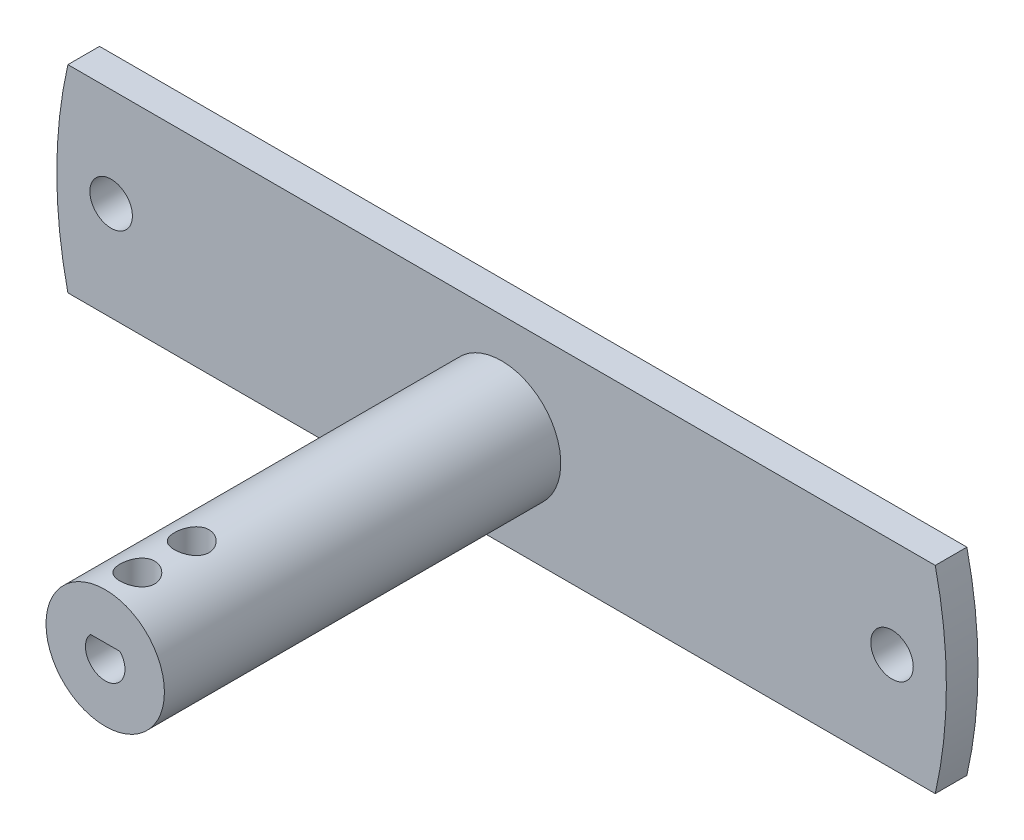
ISO-10303-21;
HEADER;
FILE_DESCRIPTION(('STEP AP214'),'2;1');
FILE_NAME('part.step','',(''),(''),'','','');
FILE_SCHEMA(('AUTOMOTIVE_DESIGN { 1 0 10303 214 1 1 1 1 }'));
ENDSEC;
DATA;
#1=APPLICATION_CONTEXT('core data for automotive mechanical design processes');
#2=APPLICATION_PROTOCOL_DEFINITION('international standard','automotive_design',2000,#1);
#3=PRODUCT_CONTEXT('',#1,'mechanical');
#4=PRODUCT('Part','Part','',(#3));
#5=PRODUCT_RELATED_PRODUCT_CATEGORY('part','',(#4));
#6=PRODUCT_DEFINITION_FORMATION('','',#4);
#7=PRODUCT_DEFINITION_CONTEXT('part definition',#1,'design');
#8=PRODUCT_DEFINITION('design','',#6,#7);
#9=PRODUCT_DEFINITION_SHAPE('','',#8);
#10=(LENGTH_UNIT() NAMED_UNIT(*) SI_UNIT(.MILLI.,.METRE.));
#11=(NAMED_UNIT(*) PLANE_ANGLE_UNIT() SI_UNIT($,.RADIAN.));
#12=(NAMED_UNIT(*) SI_UNIT($,.STERADIAN.) SOLID_ANGLE_UNIT());
#13=UNCERTAINTY_MEASURE_WITH_UNIT(LENGTH_MEASURE(1.E-05),#10,'distance_accuracy_value','');
#14=(GEOMETRIC_REPRESENTATION_CONTEXT(3) GLOBAL_UNCERTAINTY_ASSIGNED_CONTEXT((#13)) GLOBAL_UNIT_ASSIGNED_CONTEXT((#10,
#11,#12)) REPRESENTATION_CONTEXT('',''));
#15=CARTESIAN_POINT('',(0.,0.,0.));
#16=DIRECTION('',(0.,0.,1.));
#17=DIRECTION('',(1.,0.,0.));
#18=AXIS2_PLACEMENT_3D('',#15,#16,#17);
#19=CARTESIAN_POINT('',(0.,0.,3.2));
#20=DIRECTION('',(0.,0.,-1.));
#21=DIRECTION('',(-1.,0.,0.));
#22=AXIS2_PLACEMENT_3D('',#19,#20,#21);
#23=CYLINDRICAL_SURFACE('',#22,45.);
#24=CARTESIAN_POINT('',(0.,0.,0.));
#25=DIRECTION('',(0.,0.,-1.));
#26=DIRECTION('',(-1.,0.,0.));
#27=AXIS2_PLACEMENT_3D('',#24,#25,#26);
#28=CIRCLE('',#27,45.);
#29=CARTESIAN_POINT('',(-43.8748219369606,-10.,0.));
#30=VERTEX_POINT('',#29);
#31=CARTESIAN_POINT('',(-43.8748219369606,10.,0.));
#32=VERTEX_POINT('',#31);
#33=EDGE_CURVE('E127',#30,#32,#28,.T.);
#34=ORIENTED_EDGE('',*,*,#33,.F.);
#35=DIRECTION('',(0.,0.,-1.));
#36=VECTOR('',#35,1.);
#37=CARTESIAN_POINT('',(-43.8748219369606,-9.99999999999999,3.2));
#38=LINE('',#37,#36);
#39=CARTESIAN_POINT('',(-43.8748219369606,-9.99999999999999,3.2));
#40=VERTEX_POINT('',#39);
#41=EDGE_CURVE('E56',#30,#40,#38,.F.);
#42=ORIENTED_EDGE('',*,*,#41,.T.);
#43=CARTESIAN_POINT('',(0.,0.,3.2));
#44=DIRECTION('',(0.,0.,-1.));
#45=DIRECTION('',(-1.,0.,0.));
#46=AXIS2_PLACEMENT_3D('',#43,#44,#45);
#47=CIRCLE('',#46,45.);
#48=CARTESIAN_POINT('',(-43.8748219369606,10.,3.2));
#49=VERTEX_POINT('',#48);
#50=EDGE_CURVE('E129',#40,#49,#47,.T.);
#51=ORIENTED_EDGE('',*,*,#50,.T.);
#52=DIRECTION('',(0.,0.,-1.));
#53=VECTOR('',#52,1.);
#54=CARTESIAN_POINT('',(-43.8748219369606,10.,3.2));
#55=LINE('',#54,#53);
#56=EDGE_CURVE('E117',#49,#32,#55,.T.);
#57=ORIENTED_EDGE('',*,*,#56,.T.);
#58=EDGE_LOOP('',(#34,#42,#51,#57));
#59=FACE_BOUND('',#58,.T.);
#60=ADVANCED_FACE('F41',(#59),#23,.T.);
#61=CARTESIAN_POINT('',(43.8748219369606,9.99999999999999,3.2));
#62=VERTEX_POINT('',#61);
#63=CARTESIAN_POINT('',(43.8748219369606,-10.,3.2));
#64=VERTEX_POINT('',#63);
#65=EDGE_CURVE('E144',#62,#64,#47,.T.);
#66=ORIENTED_EDGE('',*,*,#65,.T.);
#67=DIRECTION('',(0.,0.,-1.));
#68=VECTOR('',#67,1.);
#69=CARTESIAN_POINT('',(43.8748219369606,-10.,3.2));
#70=LINE('',#69,#68);
#71=CARTESIAN_POINT('',(43.8748219369606,-10.,0.));
#72=VERTEX_POINT('',#71);
#73=EDGE_CURVE('E284',#64,#72,#70,.T.);
#74=ORIENTED_EDGE('',*,*,#73,.T.);
#75=CARTESIAN_POINT('',(43.8748219369606,9.99999999999999,0.));
#76=VERTEX_POINT('',#75);
#77=EDGE_CURVE('E134',#76,#72,#28,.T.);
#78=ORIENTED_EDGE('',*,*,#77,.F.);
#79=DIRECTION('',(0.,0.,-1.));
#80=VECTOR('',#79,1.);
#81=CARTESIAN_POINT('',(43.8748219369606,9.99999999999999,3.2));
#82=LINE('',#81,#80);
#83=EDGE_CURVE('E64',#76,#62,#82,.F.);
#84=ORIENTED_EDGE('',*,*,#83,.T.);
#85=EDGE_LOOP('',(#66,#74,#78,#84));
#86=FACE_BOUND('',#85,.T.);
#87=ADVANCED_FACE('F211',(#86),#23,.T.);
#88=CARTESIAN_POINT('',(0.,0.,43.3));
#89=DIRECTION('',(0.,0.,-1.));
#90=DIRECTION('',(-1.,0.,0.));
#91=AXIS2_PLACEMENT_3D('',#88,#89,#90);
#92=CYLINDRICAL_SURFACE('',#91,5.99);
#93=CARTESIAN_POINT('',(1.75,5.7286647658944,40.05));
#94=CARTESIAN_POINT('',(1.74999849954952,5.72866596481282,39.9539805321344));
#95=CARTESIAN_POINT('',(1.74207047356023,5.73110528707994,39.85794608299));
#96=CARTESIAN_POINT('',(1.71064415620623,5.74056249399311,39.6686764755281));
#97=CARTESIAN_POINT('',(1.68714003978642,5.74758209152857,39.5754423781105));
#98=CARTESIAN_POINT('',(1.62542100652919,5.76533844778758,39.3945402185607));
#99=CARTESIAN_POINT('',(1.58722961705406,5.77606925880968,39.3068635144236));
#100=CARTESIAN_POINT('',(1.49729665997941,5.8000310191613,39.1391420335143));
#101=CARTESIAN_POINT('',(1.4455532943731,5.81326230017547,39.0590982713654));
#102=CARTESIAN_POINT('',(1.32832299163368,5.84117944836808,38.9065125973945));
#103=CARTESIAN_POINT('',(1.26250079313255,5.85589507229449,38.8342336496732));
#104=CARTESIAN_POINT('',(1.11970038655035,5.8848680007928,38.7015671498216));
#105=CARTESIAN_POINT('',(1.04272081831543,5.89912524922655,38.6411810496248));
#106=CARTESIAN_POINT('',(0.877931723837882,5.9259115785428,38.5328836632923));
#107=CARTESIAN_POINT('',(0.789940146567155,5.93840149846275,38.4852388599751));
#108=CARTESIAN_POINT('',(0.606767477607407,5.95990123010377,38.4055232531116));
#109=CARTESIAN_POINT('',(0.511587857129823,5.96891175167452,38.373449272539));
#110=CARTESIAN_POINT('',(0.319490545526541,5.98222693375266,38.3266512973666));
#111=CARTESIAN_POINT('',(0.222690680117781,5.98665300808308,38.3114788138637));
#112=CARTESIAN_POINT('',(0.0278249484295567,5.99072742016157,38.2974981381615));
#113=CARTESIAN_POINT('',(-0.070240661313214,5.99037671131974,38.2986866804248));
#114=CARTESIAN_POINT('',(-0.261713885194662,5.98502366813156,38.3170896411266));
#115=CARTESIAN_POINT('',(-0.355172705766984,5.98016222594306,38.3338186730114));
#116=CARTESIAN_POINT('',(-0.537893469754315,5.96650395369827,38.3820370028783));
#117=CARTESIAN_POINT('',(-0.627155152556426,5.95770687962245,38.4135272160983));
#118=CARTESIAN_POINT('',(-0.800122405018607,5.93696755439024,38.4907131024486));
#119=CARTESIAN_POINT('',(-0.88375409721701,5.9249910045413,38.5365647335514));
#120=CARTESIAN_POINT('',(-1.04229403937443,5.89916810217805,38.6410494983552));
#121=CARTESIAN_POINT('',(-1.11720030039287,5.88532132489732,38.6996855375172));
#122=CARTESIAN_POINT('',(-1.25906051400696,5.85664579243067,38.8306069925198));
#123=CARTESIAN_POINT('',(-1.32562259663763,5.84179964657457,38.903313759069));
#124=CARTESIAN_POINT('',(-1.44571630853588,5.81324564186245,39.0590050970819));
#125=CARTESIAN_POINT('',(-1.49924677799858,5.79953788439372,39.1419905823538));
#126=CARTESIAN_POINT('',(-1.59213847931377,5.77473261298293,39.3168702216849));
#127=CARTESIAN_POINT('',(-1.63137268583594,5.76365878934006,39.408835452263));
#128=CARTESIAN_POINT('',(-1.69368482651349,5.7456588518714,39.5984648891489));
#129=CARTESIAN_POINT('',(-1.71676771306117,5.73873146673975,39.6961273385896));
#130=CARTESIAN_POINT('',(-1.74540362111343,5.73008581448065,39.8906649323367));
#131=CARTESIAN_POINT('',(-1.75154961624492,5.72819142703796,39.987445042147));
#132=CARTESIAN_POINT('',(-1.7477878110727,5.72934048736523,40.1806546674105));
#133=CARTESIAN_POINT('',(-1.73788212087411,5.73238328610797,40.2770842272757));
#134=CARTESIAN_POINT('',(-1.70282500119265,5.74289166275147,40.4644294122805));
#135=CARTESIAN_POINT('',(-1.67804912110811,5.75024819452629,40.5554220445304));
#136=CARTESIAN_POINT('',(-1.61438710119158,5.76844373342868,40.7319547798646));
#137=CARTESIAN_POINT('',(-1.57549886075321,5.77928325896779,40.8174940689962));
#138=CARTESIAN_POINT('',(-1.48357214600722,5.8035698261713,40.9831206394351));
#139=CARTESIAN_POINT('',(-1.43019586024432,5.81707669388447,41.0630114394091));
#140=CARTESIAN_POINT('',(-1.31121360595207,5.84504464557959,41.2129191983655));
#141=CARTESIAN_POINT('',(-1.24560486345228,5.85950594551791,41.2829339113961));
#142=CARTESIAN_POINT('',(-1.10124316262991,5.88837514860607,41.4136630311518));
#143=CARTESIAN_POINT('',(-1.02210604503046,5.90276290291193,41.4739586657498));
#144=CARTESIAN_POINT('',(-0.854497914162279,5.92934416146429,41.5804207243448));
#145=CARTESIAN_POINT('',(-0.766027380162811,5.94153777829244,41.6265878733624));
#146=CARTESIAN_POINT('',(-0.582865818872134,5.96228042343668,41.7030386946594));
#147=CARTESIAN_POINT('',(-0.488228062433145,5.9708568502948,41.7334421877794));
#148=CARTESIAN_POINT('',(-0.29489281470254,5.98351982522381,41.7778217561389));
#149=CARTESIAN_POINT('',(-0.19619642709971,5.98760758565825,41.7918022672047));
#150=CARTESIAN_POINT('',(-0.00142539772059387,5.99076285353007,41.8026159418251));
#151=CARTESIAN_POINT('',(0.0946129843232875,5.99000863247469,41.8000579912211));
#152=CARTESIAN_POINT('',(0.284833672807654,5.98398068749199,41.7793126752203));
#153=CARTESIAN_POINT('',(0.379016075030701,5.97870719742121,41.7611261185496));
#154=CARTESIAN_POINT('',(0.561965369496598,5.96428047512092,41.7100094046532));
#155=CARTESIAN_POINT('',(0.650776009576452,5.95516546030711,41.6772243041354));
#156=CARTESIAN_POINT('',(0.821684008355927,5.9340002589462,41.5979704137993));
#157=CARTESIAN_POINT('',(0.903780295170839,5.92194960496826,41.5514994445849));
#158=CARTESIAN_POINT('',(1.06167239470788,5.89572368407655,41.4445330272812));
#159=CARTESIAN_POINT('',(1.1371966950768,5.88149446221585,41.383650124435));
#160=CARTESIAN_POINT('',(1.27716103306232,5.85269817156102,41.250294776774));
#161=CARTESIAN_POINT('',(1.34159794066943,5.83813100867775,41.1778190703764));
#162=CARTESIAN_POINT('',(1.45935356354642,5.80983335792135,41.0209133623131));
#163=CARTESIAN_POINT('',(1.51231300160476,5.79613743161686,40.9362068321047));
#164=CARTESIAN_POINT('',(1.60317359457678,5.77166889824128,40.7587048518444));
#165=CARTESIAN_POINT('',(1.6410826543946,5.76089475750694,40.6659136794008));
#166=CARTESIAN_POINT('',(1.69696372107224,5.74466306589438,40.4865088205315));
#167=CARTESIAN_POINT('',(1.7167996149459,5.73871830854198,40.4005161455072));
#168=CARTESIAN_POINT('',(1.74331728668969,5.73071895009005,40.226352935018));
#169=CARTESIAN_POINT('',(1.75000137799038,5.72866366482639,40.1381827853389));
#170=CARTESIAN_POINT('',(1.75,5.7286647658944,40.05));
#171=B_SPLINE_CURVE_WITH_KNOTS('',3,(#93,#94,#95,#96,#97,#98,#99,#100,#101,#102,#103,#104,#105,
#106,#107,#108,#109,#110,#111,#112,#113,#114,#115,#116,#117,#118,#119,#120,#121,#122,#123,#124,
#125,#126,#127,#128,#129,#130,#131,#132,#133,#134,#135,#136,#137,#138,#139,#140,#141,#142,#143,
#144,#145,#146,#147,#148,#149,#150,#151,#152,#153,#154,#155,#156,#157,#158,#159,#160,#161,#162,
#163,#164,#165,#166,#167,#168,#169,#170),.UNSPECIFIED.,.T.,.F.,(4,2,2,2,2,2,2,2,2,2,2,2,2,2,2,2,
2,2,2,2,2,2,2,2,2,2,2,2,2,2,2,2,2,2,2,2,2,2,4),(0.,0.287733373352495,0.575574412317035,
0.862956270058567,1.15037627548514,1.44560669040764,1.74087312610092,2.04190247598271,
2.34287037885424,2.63564618985716,2.9283635658607,3.21223503837236,3.49612411410307,
3.78320971903619,4.07036063689461,4.36803140796046,4.66572866184899,4.96600999166257,
5.26619920743259,5.55573636008259,5.84523545415765,6.12771391804421,6.41023444573867,
6.70001193207344,6.98985521173615,7.28999554717243,7.59012047795121,7.88792939605676,
8.18565785784805,8.47248907652876,8.75930545358218,9.04333339270863,9.32740658613449,
9.6202186743764,9.91311328934856,10.2141581846517,10.5150447524162,10.7793411001714,
11.0435909534691),.UNSPECIFIED.);
#172=CARTESIAN_POINT('',(1.75,5.7286647658944,40.05));
#173=VERTEX_POINT('',#172);
#174=EDGE_CURVE('E164',#173,#173,#171,.T.);
#175=ORIENTED_EDGE('',*,*,#174,.F.);
#176=EDGE_LOOP('',(#175));
#177=FACE_BOUND('',#176,.T.);
#178=CARTESIAN_POINT('',(1.75,5.7286647658944,34.55));
#179=CARTESIAN_POINT('',(1.74999849954952,5.72866596481282,34.4539805321344));
#180=CARTESIAN_POINT('',(1.74207047356023,5.73110528707994,34.35794608299));
#181=CARTESIAN_POINT('',(1.71064415620623,5.74056249399311,34.1686764755281));
#182=CARTESIAN_POINT('',(1.68714003978642,5.74758209152857,34.0754423781105));
#183=CARTESIAN_POINT('',(1.62542100652919,5.76533844778758,33.8945402185607));
#184=CARTESIAN_POINT('',(1.58722961705406,5.77606925880968,33.8068635144236));
#185=CARTESIAN_POINT('',(1.49729665997941,5.8000310191613,33.6391420335143));
#186=CARTESIAN_POINT('',(1.4455532943731,5.81326230017547,33.5590982713654));
#187=CARTESIAN_POINT('',(1.32832299163368,5.84117944836808,33.4065125973945));
#188=CARTESIAN_POINT('',(1.26250079313255,5.85589507229449,33.3342336496732));
#189=CARTESIAN_POINT('',(1.11970038655035,5.8848680007928,33.2015671498216));
#190=CARTESIAN_POINT('',(1.04272081831543,5.89912524922655,33.1411810496248));
#191=CARTESIAN_POINT('',(0.877931723837882,5.9259115785428,33.0328836632923));
#192=CARTESIAN_POINT('',(0.789940146567155,5.93840149846275,32.9852388599751));
#193=CARTESIAN_POINT('',(0.606767477607407,5.95990123010377,32.9055232531116));
#194=CARTESIAN_POINT('',(0.511587857129823,5.96891175167452,32.873449272539));
#195=CARTESIAN_POINT('',(0.319490545526541,5.98222693375266,32.8266512973665));
#196=CARTESIAN_POINT('',(0.222690680117781,5.98665300808308,32.8114788138637));
#197=CARTESIAN_POINT('',(0.0278249484295567,5.99072742016157,32.7974981381615));
#198=CARTESIAN_POINT('',(-0.0702406613132141,5.99037671131974,32.7986866804248));
#199=CARTESIAN_POINT('',(-0.261713885194662,5.98502366813156,32.8170896411266));
#200=CARTESIAN_POINT('',(-0.355172705766984,5.98016222594306,32.8338186730114));
#201=CARTESIAN_POINT('',(-0.537893469754315,5.96650395369827,32.8820370028783));
#202=CARTESIAN_POINT('',(-0.627155152556426,5.95770687962245,32.9135272160983));
#203=CARTESIAN_POINT('',(-0.800122405018607,5.93696755439024,32.9907131024486));
#204=CARTESIAN_POINT('',(-0.88375409721701,5.9249910045413,33.0365647335514));
#205=CARTESIAN_POINT('',(-1.04229403937443,5.89916810217805,33.1410494983552));
#206=CARTESIAN_POINT('',(-1.11720030039287,5.88532132489732,33.1996855375172));
#207=CARTESIAN_POINT('',(-1.25906051400696,5.85664579243067,33.3306069925198));
#208=CARTESIAN_POINT('',(-1.32562259663763,5.84179964657457,33.403313759069));
#209=CARTESIAN_POINT('',(-1.44571630853588,5.81324564186245,33.5590050970819));
#210=CARTESIAN_POINT('',(-1.49924677799858,5.79953788439372,33.6419905823538));
#211=CARTESIAN_POINT('',(-1.59213847931377,5.77473261298293,33.8168702216849));
#212=CARTESIAN_POINT('',(-1.63137268583593,5.76365878934007,33.908835452263));
#213=CARTESIAN_POINT('',(-1.69368482651349,5.7456588518714,34.0984648891489));
#214=CARTESIAN_POINT('',(-1.71676771306117,5.73873146673975,34.1961273385895));
#215=CARTESIAN_POINT('',(-1.74540362111343,5.73008581448065,34.3906649323367));
#216=CARTESIAN_POINT('',(-1.75154961624492,5.72819142703796,34.487445042147));
#217=CARTESIAN_POINT('',(-1.7477878110727,5.72934048736523,34.6806546674104));
#218=CARTESIAN_POINT('',(-1.73788212087411,5.73238328610797,34.7770842272757));
#219=CARTESIAN_POINT('',(-1.70282500119265,5.74289166275147,34.9644294122805));
#220=CARTESIAN_POINT('',(-1.67804912110811,5.75024819452629,35.0554220445304));
#221=CARTESIAN_POINT('',(-1.61438710119158,5.76844373342868,35.2319547798645));
#222=CARTESIAN_POINT('',(-1.57549886075321,5.77928325896779,35.3174940689962));
#223=CARTESIAN_POINT('',(-1.48357214600722,5.8035698261713,35.4831206394351));
#224=CARTESIAN_POINT('',(-1.43019586024432,5.81707669388447,35.5630114394091));
#225=CARTESIAN_POINT('',(-1.31121360595207,5.84504464557959,35.7129191983655));
#226=CARTESIAN_POINT('',(-1.24560486345228,5.85950594551791,35.7829339113961));
#227=CARTESIAN_POINT('',(-1.10124316262991,5.88837514860607,35.9136630311518));
#228=CARTESIAN_POINT('',(-1.02210604503046,5.90276290291193,35.9739586657498));
#229=CARTESIAN_POINT('',(-0.854497914162279,5.92934416146429,36.0804207243448));
#230=CARTESIAN_POINT('',(-0.766027380162811,5.94153777829244,36.1265878733624));
#231=CARTESIAN_POINT('',(-0.582865818872134,5.96228042343668,36.2030386946594));
#232=CARTESIAN_POINT('',(-0.488228062433145,5.9708568502948,36.2334421877794));
#233=CARTESIAN_POINT('',(-0.29489281470254,5.98351982522381,36.2778217561389));
#234=CARTESIAN_POINT('',(-0.19619642709971,5.98760758565825,36.2918022672047));
#235=CARTESIAN_POINT('',(-0.00142539772059391,5.99076285353007,36.3026159418251));
#236=CARTESIAN_POINT('',(0.0946129843232874,5.99000863247469,36.3000579912211));
#237=CARTESIAN_POINT('',(0.284833672807654,5.98398068749199,36.2793126752202));
#238=CARTESIAN_POINT('',(0.379016075030701,5.97870719742121,36.2611261185496));
#239=CARTESIAN_POINT('',(0.561965369496599,5.96428047512092,36.2100094046532));
#240=CARTESIAN_POINT('',(0.650776009576454,5.95516546030711,36.1772243041354));
#241=CARTESIAN_POINT('',(0.821684008355929,5.9340002589462,36.0979704137993));
#242=CARTESIAN_POINT('',(0.90378029517084,5.92194960496826,36.0514994445849));
#243=CARTESIAN_POINT('',(1.06167239470788,5.89572368407655,35.9445330272812));
#244=CARTESIAN_POINT('',(1.1371966950768,5.88149446221585,35.883650124435));
#245=CARTESIAN_POINT('',(1.27716103306232,5.85269817156102,35.750294776774));
#246=CARTESIAN_POINT('',(1.34159794066943,5.83813100867775,35.6778190703764));
#247=CARTESIAN_POINT('',(1.45935356354642,5.80983335792135,35.5209133623131));
#248=CARTESIAN_POINT('',(1.51231300160476,5.79613743161685,35.4362068321047));
#249=CARTESIAN_POINT('',(1.60317359457678,5.77166889824128,35.2587048518444));
#250=CARTESIAN_POINT('',(1.6410826543946,5.76089475750694,35.1659136794008));
#251=CARTESIAN_POINT('',(1.69696372107224,5.74466306589438,34.9865088205315));
#252=CARTESIAN_POINT('',(1.7167996149459,5.73871830854198,34.9005161455072));
#253=CARTESIAN_POINT('',(1.74331728668969,5.73071895009005,34.726352935018));
#254=CARTESIAN_POINT('',(1.75000137799038,5.72866366482639,34.6381827853389));
#255=CARTESIAN_POINT('',(1.75,5.7286647658944,34.55));
#256=B_SPLINE_CURVE_WITH_KNOTS('',3,(#178,#179,#180,#181,#182,#183,#184,#185,#186,#187,#188,
#189,#190,#191,#192,#193,#194,#195,#196,#197,#198,#199,#200,#201,#202,#203,#204,#205,#206,#207,
#208,#209,#210,#211,#212,#213,#214,#215,#216,#217,#218,#219,#220,#221,#222,#223,#224,#225,#226,
#227,#228,#229,#230,#231,#232,#233,#234,#235,#236,#237,#238,#239,#240,#241,#242,#243,#244,#245,
#246,#247,#248,#249,#250,#251,#252,#253,#254,#255),.UNSPECIFIED.,.T.,.F.,(4,2,2,2,2,2,2,2,2,2,2,
2,2,2,2,2,2,2,2,2,2,2,2,2,2,2,2,2,2,2,2,2,2,2,2,2,2,2,4),(0.,0.287733373352495,
0.575574412317035,0.862956270058567,1.15037627548514,1.44560669040764,1.74087312610092,
2.04190247598271,2.34287037885424,2.63564618985716,2.9283635658607,3.21223503837236,
3.49612411410307,3.78320971903619,4.07036063689461,4.36803140796046,4.66572866184899,
4.96600999166256,5.26619920743259,5.55573636008259,5.84523545415765,6.12771391804421,
6.41023444573867,6.70001193207344,6.98985521173615,7.28999554717243,7.59012047795121,
7.88792939605676,8.18565785784805,8.47248907652876,8.75930545358218,9.04333339270863,
9.32740658613449,9.6202186743764,9.91311328934856,10.2141581846517,10.5150447524162,
10.7793411001714,11.0435909534691),.UNSPECIFIED.);
#257=CARTESIAN_POINT('',(1.75,5.7286647658944,34.55));
#258=VERTEX_POINT('',#257);
#259=EDGE_CURVE('E151',#258,#258,#256,.T.);
#260=ORIENTED_EDGE('',*,*,#259,.F.);
#261=EDGE_LOOP('',(#260));
#262=FACE_BOUND('',#261,.T.);
#263=CARTESIAN_POINT('',(0.,0.,43.3));
#264=DIRECTION('',(0.,0.,1.));
#265=DIRECTION('',(1.,0.,0.));
#266=AXIS2_PLACEMENT_3D('',#263,#264,#265);
#267=CIRCLE('',#266,5.99);
#268=CARTESIAN_POINT('',(5.99,0.,43.3));
#269=VERTEX_POINT('',#268);
#270=EDGE_CURVE('E252',#269,#269,#267,.T.);
#271=ORIENTED_EDGE('',*,*,#270,.F.);
#272=EDGE_LOOP('',(#271));
#273=FACE_BOUND('',#272,.T.);
#274=CARTESIAN_POINT('',(0.,0.,3.2));
#275=DIRECTION('',(0.,0.,-1.));
#276=DIRECTION('',(-1.,0.,0.));
#277=AXIS2_PLACEMENT_3D('',#274,#275,#276);
#278=CIRCLE('',#277,5.99);
#279=CARTESIAN_POINT('',(-5.99,0.,3.2));
#280=VERTEX_POINT('',#279);
#281=EDGE_CURVE('E123',#280,#280,#278,.T.);
#282=ORIENTED_EDGE('',*,*,#281,.F.);
#283=EDGE_LOOP('',(#282));
#284=FACE_BOUND('',#283,.T.);
#285=ADVANCED_FACE('F43',(#177,#262,#273,#284),#92,.T.);
#286=CARTESIAN_POINT('',(0.,0.,43.3));
#287=DIRECTION('',(0.,0.,-1.));
#288=DIRECTION('',(-1.,0.,0.));
#289=AXIS2_PLACEMENT_3D('',#286,#287,#288);
#290=CYLINDRICAL_SURFACE('',#289,2.);
#291=DIRECTION('',(0.,0.,-1.));
#292=VECTOR('',#291,1.);
#293=CARTESIAN_POINT('',(1.5,1.3228756555323,43.3));
#294=LINE('',#293,#292);
#295=CARTESIAN_POINT('',(1.5,1.3228756555323,33.648612181134));
#296=VERTEX_POINT('',#295);
#297=CARTESIAN_POINT('',(1.5,1.3228756555323,3.20000000000002));
#298=VERTEX_POINT('',#297);
#299=EDGE_CURVE('E253',#296,#298,#294,.T.);
#300=ORIENTED_EDGE('',*,*,#299,.T.);
#301=CARTESIAN_POINT('',(0.,0.,3.2));
#302=DIRECTION('',(0.,0.,-1.));
#303=DIRECTION('',(-1.,0.,0.));
#304=AXIS2_PLACEMENT_3D('',#301,#302,#303);
#305=CIRCLE('',#304,2.);
#306=CARTESIAN_POINT('',(-1.5,1.3228756555323,3.2));
#307=VERTEX_POINT('',#306);
#308=EDGE_CURVE('E140',#298,#307,#305,.T.);
#309=ORIENTED_EDGE('',*,*,#308,.T.);
#310=DIRECTION('',(0.,0.,-1.));
#311=VECTOR('',#310,1.);
#312=CARTESIAN_POINT('',(-1.5,1.3228756555323,43.3));
#313=LINE('',#312,#311);
#314=CARTESIAN_POINT('',(-1.5,1.3228756555323,33.648612181134));
#315=VERTEX_POINT('',#314);
#316=EDGE_CURVE('E325',#315,#307,#313,.T.);
#317=ORIENTED_EDGE('',*,*,#316,.F.);
#318=CARTESIAN_POINT('',(-1.5,1.32287565553229,35.451387818866));
#319=VERTEX_POINT('',#318);
#320=EDGE_CURVE('E327',#319,#315,#313,.T.);
#321=ORIENTED_EDGE('',*,*,#320,.F.);
#322=CARTESIAN_POINT('',(-1.5,1.3228756555323,39.148612181134));
#323=VERTEX_POINT('',#322);
#324=EDGE_CURVE('E332',#323,#319,#313,.T.);
#325=ORIENTED_EDGE('',*,*,#324,.F.);
#326=CARTESIAN_POINT('',(-1.5,1.32287565553229,40.951387818866));
#327=VERTEX_POINT('',#326);
#328=EDGE_CURVE('E331',#327,#323,#313,.T.);
#329=ORIENTED_EDGE('',*,*,#328,.F.);
#330=CARTESIAN_POINT('',(-1.5,1.3228756555323,43.3));
#331=VERTEX_POINT('',#330);
#332=EDGE_CURVE('E256',#331,#327,#313,.T.);
#333=ORIENTED_EDGE('',*,*,#332,.F.);
#334=CARTESIAN_POINT('',(0.,0.,43.3));
#335=DIRECTION('',(0.,0.,1.));
#336=DIRECTION('',(1.,0.,0.));
#337=AXIS2_PLACEMENT_3D('',#334,#335,#336);
#338=CIRCLE('',#337,2.);
#339=CARTESIAN_POINT('',(1.5,1.3228756555323,43.3));
#340=VERTEX_POINT('',#339);
#341=EDGE_CURVE('E321',#331,#340,#338,.T.);
#342=ORIENTED_EDGE('',*,*,#341,.T.);
#343=CARTESIAN_POINT('',(1.5,1.3228756555323,40.951387818866));
#344=VERTEX_POINT('',#343);
#345=EDGE_CURVE('E251',#340,#344,#294,.T.);
#346=ORIENTED_EDGE('',*,*,#345,.T.);
#347=CARTESIAN_POINT('',(1.5,1.3228756555323,39.148612181134));
#348=VERTEX_POINT('',#347);
#349=EDGE_CURVE('E235',#344,#348,#294,.T.);
#350=ORIENTED_EDGE('',*,*,#349,.T.);
#351=CARTESIAN_POINT('',(1.5,1.3228756555323,35.451387818866));
#352=VERTEX_POINT('',#351);
#353=EDGE_CURVE('E240',#348,#352,#294,.T.);
#354=ORIENTED_EDGE('',*,*,#353,.T.);
#355=EDGE_CURVE('E246',#352,#296,#294,.T.);
#356=ORIENTED_EDGE('',*,*,#355,.T.);
#357=EDGE_LOOP('',(#300,#309,#317,#321,#325,#329,#333,#342,#346,#350,#354,#356));
#358=FACE_BOUND('',#357,.T.);
#359=ADVANCED_FACE('F188',(#358),#290,.F.);
#360=CARTESIAN_POINT('',(-1.5,1.3228756555323,43.3));
#361=DIRECTION('',(0.,-1.,0.));
#362=DIRECTION('',(0.,0.,-1.));
#363=AXIS2_PLACEMENT_3D('',#360,#361,#362);
#364=PLANE('',#363);
#365=ORIENTED_EDGE('',*,*,#316,.T.);
#366=DIRECTION('',(1.,0.,0.));
#367=VECTOR('',#366,1.);
#368=CARTESIAN_POINT('',(-1.5,1.3228756555323,3.2));
#369=LINE('',#368,#367);
#370=EDGE_CURVE('E147',#307,#298,#369,.T.);
#371=ORIENTED_EDGE('',*,*,#370,.T.);
#372=ORIENTED_EDGE('',*,*,#299,.F.);
#373=CARTESIAN_POINT('',(0.,1.3228756555323,34.55));
#374=DIRECTION('',(0.,-1.,0.));
#375=DIRECTION('',(0.,0.,-1.));
#376=AXIS2_PLACEMENT_3D('',#373,#374,#375);
#377=CIRCLE('',#376,1.75);
#378=EDGE_CURVE('E260',#296,#315,#377,.F.);
#379=ORIENTED_EDGE('',*,*,#378,.T.);
#380=EDGE_LOOP('',(#365,#371,#372,#379));
#381=FACE_BOUND('',#380,.T.);
#382=ADVANCED_FACE('F184',(#381),#364,.T.);
#383=ORIENTED_EDGE('',*,*,#332,.T.);
#384=CARTESIAN_POINT('',(0.,1.3228756555323,40.05));
#385=DIRECTION('',(0.,1.,0.));
#386=DIRECTION('',(-1.,0.,0.));
#387=AXIS2_PLACEMENT_3D('',#384,#385,#386);
#388=CIRCLE('',#387,1.75);
#389=EDGE_CURVE('E148',#327,#344,#388,.T.);
#390=ORIENTED_EDGE('',*,*,#389,.T.);
#391=ORIENTED_EDGE('',*,*,#345,.F.);
#392=DIRECTION('',(-1.,0.,0.));
#393=VECTOR('',#392,1.);
#394=CARTESIAN_POINT('',(-1.5,1.3228756555323,43.3));
#395=LINE('',#394,#393);
#396=EDGE_CURVE('E320',#340,#331,#395,.T.);
#397=ORIENTED_EDGE('',*,*,#396,.T.);
#398=EDGE_LOOP('',(#383,#390,#391,#397));
#399=FACE_BOUND('',#398,.T.);
#400=ADVANCED_FACE('F187',(#399),#364,.T.);
#401=ORIENTED_EDGE('',*,*,#353,.F.);
#402=CARTESIAN_POINT('',(0.,1.3228756555323,40.05));
#403=DIRECTION('',(0.,-1.,0.));
#404=DIRECTION('',(0.,0.,-1.));
#405=AXIS2_PLACEMENT_3D('',#402,#403,#404);
#406=CIRCLE('',#405,1.75);
#407=EDGE_CURVE('E242',#348,#323,#406,.F.);
#408=ORIENTED_EDGE('',*,*,#407,.T.);
#409=ORIENTED_EDGE('',*,*,#324,.T.);
#410=CARTESIAN_POINT('',(0.,1.3228756555323,34.55));
#411=DIRECTION('',(0.,1.,0.));
#412=DIRECTION('',(-1.,0.,0.));
#413=AXIS2_PLACEMENT_3D('',#410,#411,#412);
#414=CIRCLE('',#413,1.75);
#415=EDGE_CURVE('E154',#319,#352,#414,.T.);
#416=ORIENTED_EDGE('',*,*,#415,.T.);
#417=EDGE_LOOP('',(#401,#408,#409,#416));
#418=FACE_BOUND('',#417,.T.);
#419=ADVANCED_FACE('F190',(#418),#364,.T.);
#420=CARTESIAN_POINT('',(0.,0.,43.3));
#421=DIRECTION('',(0.,0.,1.));
#422=DIRECTION('',(1.,0.,0.));
#423=AXIS2_PLACEMENT_3D('',#420,#421,#422);
#424=PLANE('',#423);
#425=ORIENTED_EDGE('',*,*,#270,.T.);
#426=EDGE_LOOP('',(#425));
#427=FACE_BOUND('',#426,.T.);
#428=ORIENTED_EDGE('',*,*,#396,.F.);
#429=ORIENTED_EDGE('',*,*,#341,.F.);
#430=EDGE_LOOP('',(#428,#429));
#431=FACE_BOUND('',#430,.T.);
#432=ADVANCED_FACE('F194',(#427,#431),#424,.T.);
#433=CARTESIAN_POINT('',(0.,1.3228756555323,34.55));
#434=DIRECTION('',(0.,1.,0.));
#435=DIRECTION('',(-1.,0.,0.));
#436=AXIS2_PLACEMENT_3D('',#433,#434,#435);
#437=PLANE('',#436);
#438=EDGE_CURVE('E157',#352,#296,#414,.T.);
#439=ORIENTED_EDGE('',*,*,#438,.T.);
#440=ORIENTED_EDGE('',*,*,#355,.F.);
#441=EDGE_LOOP('',(#439,#440));
#442=FACE_BOUND('',#441,.T.);
#443=ADVANCED_FACE('F175',(#442),#437,.T.);
#444=CARTESIAN_POINT('',(0.,8.8228756555323,34.55));
#445=DIRECTION('',(0.,-1.,0.));
#446=DIRECTION('',(1.,0.,0.));
#447=AXIS2_PLACEMENT_3D('',#444,#445,#446);
#448=CYLINDRICAL_SURFACE('',#447,1.75);
#449=ORIENTED_EDGE('',*,*,#415,.F.);
#450=EDGE_CURVE('E143',#315,#319,#414,.T.);
#451=ORIENTED_EDGE('',*,*,#450,.F.);
#452=ORIENTED_EDGE('',*,*,#378,.F.);
#453=ORIENTED_EDGE('',*,*,#438,.F.);
#454=EDGE_LOOP('',(#449,#451,#452,#453));
#455=FACE_BOUND('',#454,.T.);
#456=ORIENTED_EDGE('',*,*,#259,.T.);
#457=EDGE_LOOP('',(#456));
#458=FACE_BOUND('',#457,.T.);
#459=ADVANCED_FACE('F170',(#455,#458),#448,.F.);
#460=ORIENTED_EDGE('',*,*,#450,.T.);
#461=ORIENTED_EDGE('',*,*,#320,.T.);
#462=EDGE_LOOP('',(#460,#461));
#463=FACE_BOUND('',#462,.T.);
#464=ADVANCED_FACE('F174',(#463),#437,.T.);
#465=CARTESIAN_POINT('',(0.,1.3228756555323,40.05));
#466=DIRECTION('',(0.,1.,0.));
#467=DIRECTION('',(-1.,0.,0.));
#468=AXIS2_PLACEMENT_3D('',#465,#466,#467);
#469=PLANE('',#468);
#470=EDGE_CURVE('E152',#344,#348,#388,.T.);
#471=ORIENTED_EDGE('',*,*,#470,.T.);
#472=ORIENTED_EDGE('',*,*,#349,.F.);
#473=EDGE_LOOP('',(#471,#472));
#474=FACE_BOUND('',#473,.T.);
#475=ADVANCED_FACE('F182',(#474),#469,.T.);
#476=CARTESIAN_POINT('',(0.,8.8228756555323,40.05));
#477=DIRECTION('',(0.,-1.,0.));
#478=DIRECTION('',(1.,0.,0.));
#479=AXIS2_PLACEMENT_3D('',#476,#477,#478);
#480=CYLINDRICAL_SURFACE('',#479,1.75);
#481=ORIENTED_EDGE('',*,*,#389,.F.);
#482=EDGE_CURVE('E153',#323,#327,#388,.T.);
#483=ORIENTED_EDGE('',*,*,#482,.F.);
#484=ORIENTED_EDGE('',*,*,#407,.F.);
#485=ORIENTED_EDGE('',*,*,#470,.F.);
#486=EDGE_LOOP('',(#481,#483,#484,#485));
#487=FACE_BOUND('',#486,.T.);
#488=ORIENTED_EDGE('',*,*,#174,.T.);
#489=EDGE_LOOP('',(#488));
#490=FACE_BOUND('',#489,.T.);
#491=ADVANCED_FACE('F177',(#487,#490),#480,.F.);
#492=ORIENTED_EDGE('',*,*,#482,.T.);
#493=ORIENTED_EDGE('',*,*,#328,.T.);
#494=EDGE_LOOP('',(#492,#493));
#495=FACE_BOUND('',#494,.T.);
#496=ADVANCED_FACE('F218',(#495),#469,.T.);
#497=CARTESIAN_POINT('',(0.,0.,3.2));
#498=DIRECTION('',(0.,0.,-1.));
#499=DIRECTION('',(-1.,0.,0.));
#500=AXIS2_PLACEMENT_3D('',#497,#498,#499);
#501=PLANE('',#500);
#502=ORIENTED_EDGE('',*,*,#308,.F.);
#503=ORIENTED_EDGE('',*,*,#370,.F.);
#504=EDGE_LOOP('',(#502,#503));
#505=FACE_BOUND('',#504,.T.);
#506=ADVANCED_FACE('F207',(#505),#501,.F.);
#507=DIRECTION('',(-1.,0.,0.));
#508=VECTOR('',#507,1.);
#509=CARTESIAN_POINT('',(0.,-10.,3.2));
#510=LINE('',#509,#508);
#511=EDGE_CURVE('E135',#64,#40,#510,.T.);
#512=ORIENTED_EDGE('',*,*,#511,.F.);
#513=ORIENTED_EDGE('',*,*,#65,.F.);
#514=DIRECTION('',(1.,0.,0.));
#515=VECTOR('',#514,1.);
#516=CARTESIAN_POINT('',(0.,10.,3.2));
#517=LINE('',#516,#515);
#518=EDGE_CURVE('E282',#49,#62,#517,.T.);
#519=ORIENTED_EDGE('',*,*,#518,.F.);
#520=ORIENTED_EDGE('',*,*,#50,.F.);
#521=EDGE_LOOP('',(#512,#513,#519,#520));
#522=FACE_BOUND('',#521,.T.);
#523=CARTESIAN_POINT('',(-39.5,0.,3.2));
#524=DIRECTION('',(0.,0.,-1.));
#525=DIRECTION('',(-1.,0.,0.));
#526=AXIS2_PLACEMENT_3D('',#523,#524,#525);
#527=CIRCLE('',#526,2.15);
#528=CARTESIAN_POINT('',(-37.35,0.,3.2));
#529=VERTEX_POINT('',#528);
#530=EDGE_CURVE('E130',#529,#529,#527,.F.);
#531=ORIENTED_EDGE('',*,*,#530,.F.);
#532=EDGE_LOOP('',(#531));
#533=FACE_BOUND('',#532,.T.);
#534=CARTESIAN_POINT('',(39.5,0.,3.2));
#535=DIRECTION('',(0.,0.,-1.));
#536=DIRECTION('',(-1.,0.,0.));
#537=AXIS2_PLACEMENT_3D('',#534,#535,#536);
#538=CIRCLE('',#537,2.15);
#539=CARTESIAN_POINT('',(41.65,0.,3.2));
#540=VERTEX_POINT('',#539);
#541=EDGE_CURVE('E269',#540,#540,#538,.F.);
#542=ORIENTED_EDGE('',*,*,#541,.F.);
#543=EDGE_LOOP('',(#542));
#544=FACE_BOUND('',#543,.T.);
#545=ORIENTED_EDGE('',*,*,#281,.T.);
#546=EDGE_LOOP('',(#545));
#547=FACE_BOUND('',#546,.T.);
#548=ADVANCED_FACE('F199',(#522,#533,#544,#547),#501,.F.);
#549=CARTESIAN_POINT('',(0.,0.,0.));
#550=DIRECTION('',(0.,0.,1.));
#551=DIRECTION('',(1.,0.,0.));
#552=AXIS2_PLACEMENT_3D('',#549,#550,#551);
#553=PLANE('',#552);
#554=DIRECTION('',(1.,0.,0.));
#555=VECTOR('',#554,1.);
#556=CARTESIAN_POINT('',(0.,-10.,0.));
#557=LINE('',#556,#555);
#558=EDGE_CURVE('E11',#30,#72,#557,.T.);
#559=ORIENTED_EDGE('',*,*,#558,.F.);
#560=ORIENTED_EDGE('',*,*,#33,.T.);
#561=DIRECTION('',(-1.,0.,0.));
#562=VECTOR('',#561,1.);
#563=CARTESIAN_POINT('',(0.,10.,0.));
#564=LINE('',#563,#562);
#565=EDGE_CURVE('E50',#76,#32,#564,.T.);
#566=ORIENTED_EDGE('',*,*,#565,.F.);
#567=ORIENTED_EDGE('',*,*,#77,.T.);
#568=EDGE_LOOP('',(#559,#560,#566,#567));
#569=FACE_BOUND('',#568,.T.);
#570=CARTESIAN_POINT('',(-39.5,0.,0.));
#571=DIRECTION('',(0.,0.,1.));
#572=DIRECTION('',(1.,0.,0.));
#573=AXIS2_PLACEMENT_3D('',#570,#571,#572);
#574=CIRCLE('',#573,2.15);
#575=CARTESIAN_POINT('',(-37.35,0.,0.));
#576=VERTEX_POINT('',#575);
#577=EDGE_CURVE('E270',#576,#576,#574,.F.);
#578=ORIENTED_EDGE('',*,*,#577,.F.);
#579=EDGE_LOOP('',(#578));
#580=FACE_BOUND('',#579,.T.);
#581=CARTESIAN_POINT('',(39.5,0.,0.));
#582=DIRECTION('',(0.,0.,1.));
#583=DIRECTION('',(1.,0.,0.));
#584=AXIS2_PLACEMENT_3D('',#581,#582,#583);
#585=CIRCLE('',#584,2.15);
#586=CARTESIAN_POINT('',(41.65,0.,0.));
#587=VERTEX_POINT('',#586);
#588=EDGE_CURVE('E266',#587,#587,#585,.F.);
#589=ORIENTED_EDGE('',*,*,#588,.F.);
#590=EDGE_LOOP('',(#589));
#591=FACE_BOUND('',#590,.T.);
#592=ADVANCED_FACE('F132',(#569,#580,#591),#553,.F.);
#593=CARTESIAN_POINT('',(39.5,0.,-1.2E-05));
#594=DIRECTION('',(0.,0.,1.));
#595=DIRECTION('',(1.,0.,0.));
#596=AXIS2_PLACEMENT_3D('',#593,#594,#595);
#597=CYLINDRICAL_SURFACE('',#596,2.15);
#598=CARTESIAN_POINT('',(41.65,0.,0.));
#599=CARTESIAN_POINT('',(41.65,0.,0.0333333333333334));
#600=CARTESIAN_POINT('',(41.65,0.,0.0666666666666667));
#601=CARTESIAN_POINT('',(41.65,0.,0.133333333333333));
#602=CARTESIAN_POINT('',(41.65,0.,0.166666666666667));
#603=CARTESIAN_POINT('',(41.65,0.,0.233333333333333));
#604=CARTESIAN_POINT('',(41.65,0.,0.266666666666667));
#605=CARTESIAN_POINT('',(41.65,0.,0.333333333333333));
#606=CARTESIAN_POINT('',(41.65,0.,0.366666666666667));
#607=CARTESIAN_POINT('',(41.65,0.,0.433333333333333));
#608=CARTESIAN_POINT('',(41.65,0.,0.466666666666667));
#609=CARTESIAN_POINT('',(41.65,0.,0.533333333333333));
#610=CARTESIAN_POINT('',(41.65,0.,0.566666666666667));
#611=CARTESIAN_POINT('',(41.65,0.,0.633333333333333));
#612=CARTESIAN_POINT('',(41.65,0.,0.666666666666667));
#613=CARTESIAN_POINT('',(41.65,0.,0.733333333333334));
#614=CARTESIAN_POINT('',(41.65,0.,0.766666666666667));
#615=CARTESIAN_POINT('',(41.65,0.,0.833333333333333));
#616=CARTESIAN_POINT('',(41.65,0.,0.866666666666667));
#617=CARTESIAN_POINT('',(41.65,0.,0.933333333333333));
#618=CARTESIAN_POINT('',(41.65,0.,0.966666666666667));
#619=CARTESIAN_POINT('',(41.65,0.,1.03333333333333));
#620=CARTESIAN_POINT('',(41.65,0.,1.06666666666667));
#621=CARTESIAN_POINT('',(41.65,0.,1.13333333333333));
#622=CARTESIAN_POINT('',(41.65,0.,1.16666666666667));
#623=CARTESIAN_POINT('',(41.65,0.,1.23333333333333));
#624=CARTESIAN_POINT('',(41.65,0.,1.26666666666667));
#625=CARTESIAN_POINT('',(41.65,0.,1.33333333333333));
#626=CARTESIAN_POINT('',(41.65,0.,1.36666666666667));
#627=CARTESIAN_POINT('',(41.65,0.,1.43333333333333));
#628=CARTESIAN_POINT('',(41.65,0.,1.46666666666667));
#629=CARTESIAN_POINT('',(41.65,0.,1.53333333333333));
#630=CARTESIAN_POINT('',(41.65,0.,1.56666666666667));
#631=CARTESIAN_POINT('',(41.65,0.,1.63333333333333));
#632=CARTESIAN_POINT('',(41.65,0.,1.66666666666667));
#633=CARTESIAN_POINT('',(41.65,0.,1.73333333333333));
#634=CARTESIAN_POINT('',(41.65,0.,1.76666666666667));
#635=CARTESIAN_POINT('',(41.65,0.,1.83333333333333));
#636=CARTESIAN_POINT('',(41.65,0.,1.86666666666667));
#637=CARTESIAN_POINT('',(41.65,0.,1.93333333333333));
#638=CARTESIAN_POINT('',(41.65,0.,1.96666666666667));
#639=CARTESIAN_POINT('',(41.65,0.,2.03333333333333));
#640=CARTESIAN_POINT('',(41.65,0.,2.06666666666667));
#641=CARTESIAN_POINT('',(41.65,0.,2.13333333333333));
#642=CARTESIAN_POINT('',(41.65,0.,2.16666666666667));
#643=CARTESIAN_POINT('',(41.65,0.,2.23333333333333));
#644=CARTESIAN_POINT('',(41.65,0.,2.26666666666667));
#645=CARTESIAN_POINT('',(41.65,0.,2.33333333333333));
#646=CARTESIAN_POINT('',(41.65,0.,2.36666666666667));
#647=CARTESIAN_POINT('',(41.65,0.,2.43333333333333));
#648=CARTESIAN_POINT('',(41.65,0.,2.46666666666667));
#649=CARTESIAN_POINT('',(41.65,0.,2.53333333333333));
#650=CARTESIAN_POINT('',(41.65,0.,2.56666666666667));
#651=CARTESIAN_POINT('',(41.65,0.,2.63333333333333));
#652=CARTESIAN_POINT('',(41.65,0.,2.66666666666667));
#653=CARTESIAN_POINT('',(41.65,0.,2.73333333333333));
#654=CARTESIAN_POINT('',(41.65,0.,2.76666666666667));
#655=CARTESIAN_POINT('',(41.65,0.,2.83333333333333));
#656=CARTESIAN_POINT('',(41.65,0.,2.86666666666667));
#657=CARTESIAN_POINT('',(41.65,0.,2.93333333333333));
#658=CARTESIAN_POINT('',(41.65,0.,2.96666666666667));
#659=CARTESIAN_POINT('',(41.65,0.,3.03333333333333));
#660=CARTESIAN_POINT('',(41.65,0.,3.06666666666667));
#661=CARTESIAN_POINT('',(41.65,0.,3.13333333333333));
#662=CARTESIAN_POINT('',(41.65,0.,3.16666666666667));
#663=CARTESIAN_POINT('',(41.65,0.,3.2));
#664=B_SPLINE_CURVE_WITH_KNOTS('',3,(#598,#599,#600,#601,#602,#603,#604,#605,#606,#607,#608,
#609,#610,#611,#612,#613,#614,#615,#616,#617,#618,#619,#620,#621,#622,#623,#624,#625,#626,#627,
#628,#629,#630,#631,#632,#633,#634,#635,#636,#637,#638,#639,#640,#641,#642,#643,#644,#645,#646,
#647,#648,#649,#650,#651,#652,#653,#654,#655,#656,#657,#658,#659,#660,#661,#662,#663),
.UNSPECIFIED.,.F.,.F.,(4,2,2,2,2,2,2,2,2,2,2,2,2,2,2,2,2,2,2,2,2,2,2,2,2,2,2,2,2,2,2,2,4),(0.,
0.1,0.2,0.3,0.4,0.5,0.6,0.7,0.8,0.9,1.,1.1,1.2,1.3,1.4,1.5,1.6,1.7,1.8,1.9,2.,2.1,2.2,2.3,2.4,
2.5,2.6,2.7,2.8,2.9,3.,3.1,3.2),.UNSPECIFIED.);
#665=EDGE_CURVE('BSEAM198',#587,#540,#664,.T.);
#666=ORIENTED_EDGE('',*,*,#588,.T.);
#667=ORIENTED_EDGE('',*,*,#541,.T.);
#668=ORIENTED_EDGE('',*,*,#665,.T.);
#669=ORIENTED_EDGE('',*,*,#665,.F.);
#670=EDGE_LOOP('',(#666,#668,#667,#669));
#671=FACE_BOUND('',#670,.T.);
#672=ADVANCED_FACE('F198',(#671),#597,.F.);
#673=CARTESIAN_POINT('',(-39.5,0.,-1.2E-05));
#674=DIRECTION('',(0.,0.,1.));
#675=DIRECTION('',(1.,0.,0.));
#676=AXIS2_PLACEMENT_3D('',#673,#674,#675);
#677=CYLINDRICAL_SURFACE('',#676,2.15);
#678=CARTESIAN_POINT('',(-37.35,0.,0.));
#679=CARTESIAN_POINT('',(-37.35,0.,0.0333333333333334));
#680=CARTESIAN_POINT('',(-37.35,0.,0.0666666666666667));
#681=CARTESIAN_POINT('',(-37.35,0.,0.133333333333333));
#682=CARTESIAN_POINT('',(-37.35,0.,0.166666666666667));
#683=CARTESIAN_POINT('',(-37.35,0.,0.233333333333333));
#684=CARTESIAN_POINT('',(-37.35,0.,0.266666666666667));
#685=CARTESIAN_POINT('',(-37.35,0.,0.333333333333333));
#686=CARTESIAN_POINT('',(-37.35,0.,0.366666666666667));
#687=CARTESIAN_POINT('',(-37.35,0.,0.433333333333333));
#688=CARTESIAN_POINT('',(-37.35,0.,0.466666666666667));
#689=CARTESIAN_POINT('',(-37.35,0.,0.533333333333333));
#690=CARTESIAN_POINT('',(-37.35,0.,0.566666666666667));
#691=CARTESIAN_POINT('',(-37.35,0.,0.633333333333333));
#692=CARTESIAN_POINT('',(-37.35,0.,0.666666666666667));
#693=CARTESIAN_POINT('',(-37.35,0.,0.733333333333334));
#694=CARTESIAN_POINT('',(-37.35,0.,0.766666666666667));
#695=CARTESIAN_POINT('',(-37.35,0.,0.833333333333333));
#696=CARTESIAN_POINT('',(-37.35,0.,0.866666666666667));
#697=CARTESIAN_POINT('',(-37.35,0.,0.933333333333333));
#698=CARTESIAN_POINT('',(-37.35,0.,0.966666666666667));
#699=CARTESIAN_POINT('',(-37.35,0.,1.03333333333333));
#700=CARTESIAN_POINT('',(-37.35,0.,1.06666666666667));
#701=CARTESIAN_POINT('',(-37.35,0.,1.13333333333333));
#702=CARTESIAN_POINT('',(-37.35,0.,1.16666666666667));
#703=CARTESIAN_POINT('',(-37.35,0.,1.23333333333333));
#704=CARTESIAN_POINT('',(-37.35,0.,1.26666666666667));
#705=CARTESIAN_POINT('',(-37.35,0.,1.33333333333333));
#706=CARTESIAN_POINT('',(-37.35,0.,1.36666666666667));
#707=CARTESIAN_POINT('',(-37.35,0.,1.43333333333333));
#708=CARTESIAN_POINT('',(-37.35,0.,1.46666666666667));
#709=CARTESIAN_POINT('',(-37.35,0.,1.53333333333333));
#710=CARTESIAN_POINT('',(-37.35,0.,1.56666666666667));
#711=CARTESIAN_POINT('',(-37.35,0.,1.63333333333333));
#712=CARTESIAN_POINT('',(-37.35,0.,1.66666666666667));
#713=CARTESIAN_POINT('',(-37.35,0.,1.73333333333333));
#714=CARTESIAN_POINT('',(-37.35,0.,1.76666666666667));
#715=CARTESIAN_POINT('',(-37.35,0.,1.83333333333333));
#716=CARTESIAN_POINT('',(-37.35,0.,1.86666666666667));
#717=CARTESIAN_POINT('',(-37.35,0.,1.93333333333333));
#718=CARTESIAN_POINT('',(-37.35,0.,1.96666666666667));
#719=CARTESIAN_POINT('',(-37.35,0.,2.03333333333333));
#720=CARTESIAN_POINT('',(-37.35,0.,2.06666666666667));
#721=CARTESIAN_POINT('',(-37.35,0.,2.13333333333333));
#722=CARTESIAN_POINT('',(-37.35,0.,2.16666666666667));
#723=CARTESIAN_POINT('',(-37.35,0.,2.23333333333333));
#724=CARTESIAN_POINT('',(-37.35,0.,2.26666666666667));
#725=CARTESIAN_POINT('',(-37.35,0.,2.33333333333333));
#726=CARTESIAN_POINT('',(-37.35,0.,2.36666666666667));
#727=CARTESIAN_POINT('',(-37.35,0.,2.43333333333333));
#728=CARTESIAN_POINT('',(-37.35,0.,2.46666666666667));
#729=CARTESIAN_POINT('',(-37.35,0.,2.53333333333333));
#730=CARTESIAN_POINT('',(-37.35,0.,2.56666666666667));
#731=CARTESIAN_POINT('',(-37.35,0.,2.63333333333333));
#732=CARTESIAN_POINT('',(-37.35,0.,2.66666666666667));
#733=CARTESIAN_POINT('',(-37.35,0.,2.73333333333333));
#734=CARTESIAN_POINT('',(-37.35,0.,2.76666666666667));
#735=CARTESIAN_POINT('',(-37.35,0.,2.83333333333333));
#736=CARTESIAN_POINT('',(-37.35,0.,2.86666666666667));
#737=CARTESIAN_POINT('',(-37.35,0.,2.93333333333333));
#738=CARTESIAN_POINT('',(-37.35,0.,2.96666666666667));
#739=CARTESIAN_POINT('',(-37.35,0.,3.03333333333333));
#740=CARTESIAN_POINT('',(-37.35,0.,3.06666666666667));
#741=CARTESIAN_POINT('',(-37.35,0.,3.13333333333333));
#742=CARTESIAN_POINT('',(-37.35,0.,3.16666666666667));
#743=CARTESIAN_POINT('',(-37.35,0.,3.2));
#744=B_SPLINE_CURVE_WITH_KNOTS('',3,(#678,#679,#680,#681,#682,#683,#684,#685,#686,#687,#688,
#689,#690,#691,#692,#693,#694,#695,#696,#697,#698,#699,#700,#701,#702,#703,#704,#705,#706,#707,
#708,#709,#710,#711,#712,#713,#714,#715,#716,#717,#718,#719,#720,#721,#722,#723,#724,#725,#726,
#727,#728,#729,#730,#731,#732,#733,#734,#735,#736,#737,#738,#739,#740,#741,#742,#743),
.UNSPECIFIED.,.F.,.F.,(4,2,2,2,2,2,2,2,2,2,2,2,2,2,2,2,2,2,2,2,2,2,2,2,2,2,2,2,2,2,2,2,4),(0.,
0.1,0.2,0.3,0.4,0.5,0.6,0.7,0.8,0.9,1.,1.1,1.2,1.3,1.4,1.5,1.6,1.7,1.8,1.9,2.,2.1,2.2,2.3,2.4,
2.5,2.6,2.7,2.8,2.9,3.,3.1,3.2),.UNSPECIFIED.);
#745=EDGE_CURVE('BSEAM204',#576,#529,#744,.T.);
#746=ORIENTED_EDGE('',*,*,#577,.T.);
#747=ORIENTED_EDGE('',*,*,#530,.T.);
#748=ORIENTED_EDGE('',*,*,#745,.T.);
#749=ORIENTED_EDGE('',*,*,#745,.F.);
#750=EDGE_LOOP('',(#746,#748,#747,#749));
#751=FACE_BOUND('',#750,.T.);
#752=ADVANCED_FACE('F204',(#751),#677,.F.);
#753=CARTESIAN_POINT('',(-75.,10.,-1.2E-05));
#754=DIRECTION('',(0.,1.,0.));
#755=DIRECTION('',(-1.,0.,0.));
#756=AXIS2_PLACEMENT_3D('',#753,#754,#755);
#757=PLANE('',#756);
#758=ORIENTED_EDGE('',*,*,#518,.T.);
#759=ORIENTED_EDGE('',*,*,#83,.F.);
#760=ORIENTED_EDGE('',*,*,#565,.T.);
#761=ORIENTED_EDGE('',*,*,#56,.F.);
#762=EDGE_LOOP('',(#758,#759,#760,#761));
#763=FACE_BOUND('',#762,.T.);
#764=ADVANCED_FACE('F116',(#763),#757,.T.);
#765=CARTESIAN_POINT('',(0.,-10.,-1.2E-05));
#766=DIRECTION('',(0.,-1.,0.));
#767=DIRECTION('',(1.,0.,0.));
#768=AXIS2_PLACEMENT_3D('',#765,#766,#767);
#769=PLANE('',#768);
#770=ORIENTED_EDGE('',*,*,#511,.T.);
#771=ORIENTED_EDGE('',*,*,#41,.F.);
#772=ORIENTED_EDGE('',*,*,#558,.T.);
#773=ORIENTED_EDGE('',*,*,#73,.F.);
#774=EDGE_LOOP('',(#770,#771,#772,#773));
#775=FACE_BOUND('',#774,.T.);
#776=ADVANCED_FACE('F291',(#775),#769,.T.);
#777=CLOSED_SHELL('',(#60,#87,#285,#359,#382,#400,#419,#432,#443,#459,#464,#475,#491,#496,#506,
#548,#592,#672,#752,#764,#776));
#778=MANIFOLD_SOLID_BREP('B2',#777);
#779=ADVANCED_BREP_SHAPE_REPRESENTATION('',(#18,#778),#14);
#780=SHAPE_DEFINITION_REPRESENTATION(#9,#779);
ENDSEC;
END-ISO-10303-21;
